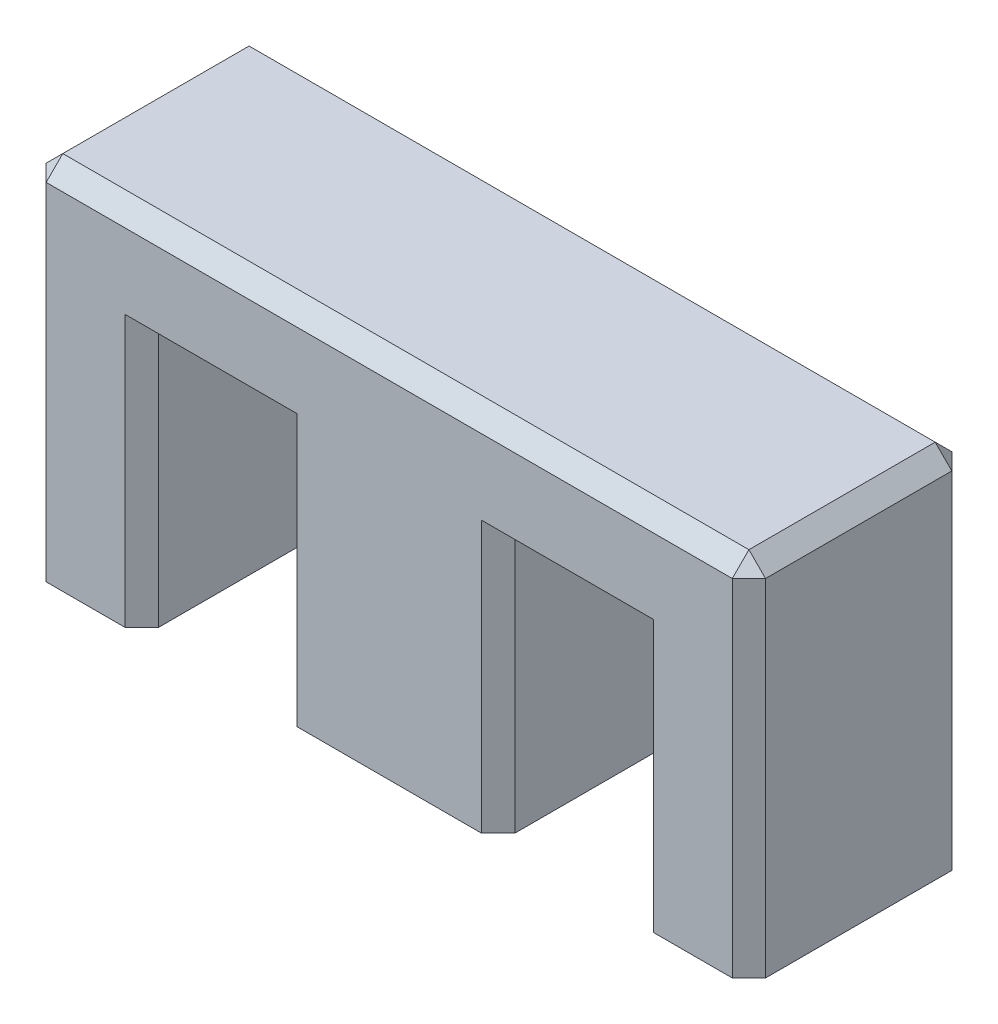
ISO-10303-21;
HEADER;
FILE_DESCRIPTION(('STEP AP214'),'2;1');
FILE_NAME('part.step','',(''),(''),'','','');
FILE_SCHEMA(('AUTOMOTIVE_DESIGN { 1 0 10303 214 1 1 1 1 }'));
ENDSEC;
DATA;
#1=APPLICATION_CONTEXT('core data for automotive mechanical design processes');
#2=APPLICATION_PROTOCOL_DEFINITION('international standard','automotive_design',2000,#1);
#3=PRODUCT_CONTEXT('',#1,'mechanical');
#4=PRODUCT('Part','Part','',(#3));
#5=PRODUCT_RELATED_PRODUCT_CATEGORY('part','',(#4));
#6=PRODUCT_DEFINITION_FORMATION('','',#4);
#7=PRODUCT_DEFINITION_CONTEXT('part definition',#1,'design');
#8=PRODUCT_DEFINITION('design','',#6,#7);
#9=PRODUCT_DEFINITION_SHAPE('','',#8);
#10=(LENGTH_UNIT() NAMED_UNIT(*) SI_UNIT(.MILLI.,.METRE.));
#11=(NAMED_UNIT(*) PLANE_ANGLE_UNIT() SI_UNIT($,.RADIAN.));
#12=(NAMED_UNIT(*) SI_UNIT($,.STERADIAN.) SOLID_ANGLE_UNIT());
#13=UNCERTAINTY_MEASURE_WITH_UNIT(LENGTH_MEASURE(1.E-05),#10,'distance_accuracy_value','');
#14=(GEOMETRIC_REPRESENTATION_CONTEXT(3) GLOBAL_UNCERTAINTY_ASSIGNED_CONTEXT((#13)) GLOBAL_UNIT_ASSIGNED_CONTEXT((#10,
#11,#12)) REPRESENTATION_CONTEXT('',''));
#15=CARTESIAN_POINT('',(0.,0.,0.));
#16=DIRECTION('',(0.,0.,1.));
#17=DIRECTION('',(1.,0.,0.));
#18=AXIS2_PLACEMENT_3D('',#15,#16,#17);
#19=CARTESIAN_POINT('',(29.75,18.1735294117647,13.2));
#20=DIRECTION('',(0.,1.,0.));
#21=DIRECTION('',(-1.,0.,0.));
#22=AXIS2_PLACEMENT_3D('',#19,#20,#21);
#23=PLANE('',#22);
#24=DIRECTION('',(0.,0.,-1.));
#25=VECTOR('',#24,1.);
#26=CARTESIAN_POINT('',(13.1,18.1735294117647,13.2));
#27=LINE('',#26,#25);
#28=CARTESIAN_POINT('',(13.1,18.1735294117647,11.2));
#29=VERTEX_POINT('',#28);
#30=CARTESIAN_POINT('',(13.1,18.1735294117647,-11.2));
#31=VERTEX_POINT('',#30);
#32=EDGE_CURVE('E416',#29,#31,#27,.T.);
#33=ORIENTED_EDGE('',*,*,#32,.T.);
#34=DIRECTION('',(1.,0.,0.));
#35=VECTOR('',#34,1.);
#36=CARTESIAN_POINT('',(29.75,18.1735294117647,-11.2));
#37=LINE('',#36,#35);
#38=CARTESIAN_POINT('',(29.75,18.1735294117647,-11.2));
#39=VERTEX_POINT('',#38);
#40=EDGE_CURVE('E340',#31,#39,#37,.T.);
#41=ORIENTED_EDGE('',*,*,#40,.T.);
#42=DIRECTION('',(0.,0.,-1.));
#43=VECTOR('',#42,1.);
#44=CARTESIAN_POINT('',(29.75,18.1735294117647,13.2));
#45=LINE('',#44,#43);
#46=CARTESIAN_POINT('',(29.75,18.1735294117647,11.2));
#47=VERTEX_POINT('',#46);
#48=EDGE_CURVE('E246',#47,#39,#45,.T.);
#49=ORIENTED_EDGE('',*,*,#48,.F.);
#50=DIRECTION('',(-1.,0.,0.));
#51=VECTOR('',#50,1.);
#52=CARTESIAN_POINT('',(13.1,18.1735294117647,11.2));
#53=LINE('',#52,#51);
#54=EDGE_CURVE('E338',#47,#29,#53,.T.);
#55=ORIENTED_EDGE('',*,*,#54,.T.);
#56=EDGE_LOOP('',(#33,#41,#49,#55));
#57=FACE_BOUND('',#56,.T.);
#58=ADVANCED_FACE('F39',(#57),#23,.F.);
#59=CARTESIAN_POINT('',(29.75,-12.4264705882353,13.2));
#60=DIRECTION('',(1.,0.,0.));
#61=DIRECTION('',(0.,1.,0.));
#62=AXIS2_PLACEMENT_3D('',#59,#60,#61);
#63=PLANE('',#62);
#64=ORIENTED_EDGE('',*,*,#48,.T.);
#65=DIRECTION('',(0.,-1.,0.));
#66=VECTOR('',#65,1.);
#67=CARTESIAN_POINT('',(29.75,-12.4264705882353,-11.2));
#68=LINE('',#67,#66);
#69=CARTESIAN_POINT('',(29.75,-12.4264705882353,-11.2));
#70=VERTEX_POINT('',#69);
#71=EDGE_CURVE('E336',#39,#70,#68,.T.);
#72=ORIENTED_EDGE('',*,*,#71,.T.);
#73=DIRECTION('',(0.,0.,-1.));
#74=VECTOR('',#73,1.);
#75=CARTESIAN_POINT('',(29.75,-12.4264705882353,13.2));
#76=LINE('',#75,#74);
#77=CARTESIAN_POINT('',(29.75,-12.4264705882353,11.2));
#78=VERTEX_POINT('',#77);
#79=EDGE_CURVE('E451',#78,#70,#76,.T.);
#80=ORIENTED_EDGE('',*,*,#79,.F.);
#81=DIRECTION('',(0.,1.,0.));
#82=VECTOR('',#81,1.);
#83=CARTESIAN_POINT('',(29.75,18.1735294117647,11.2));
#84=LINE('',#83,#82);
#85=EDGE_CURVE('E334',#78,#47,#84,.T.);
#86=ORIENTED_EDGE('',*,*,#85,.T.);
#87=EDGE_LOOP('',(#64,#72,#80,#86));
#88=FACE_BOUND('',#87,.T.);
#89=ADVANCED_FACE('F526',(#88),#63,.F.);
#90=CARTESIAN_POINT('',(43.25,-12.4264705882353,13.2));
#91=DIRECTION('',(0.,1.,0.));
#92=DIRECTION('',(-1.,0.,0.));
#93=AXIS2_PLACEMENT_3D('',#90,#91,#92);
#94=PLANE('',#93);
#95=DIRECTION('',(0.,0.,-1.));
#96=VECTOR('',#95,1.);
#97=CARTESIAN_POINT('',(43.25,-12.4264705882353,13.2));
#98=LINE('',#97,#96);
#99=CARTESIAN_POINT('',(43.25,-12.4264705882353,11.2));
#100=VERTEX_POINT('',#99);
#101=CARTESIAN_POINT('',(43.25,-12.4264705882353,-11.2));
#102=VERTEX_POINT('',#101);
#103=EDGE_CURVE('E448',#100,#102,#98,.T.);
#104=ORIENTED_EDGE('',*,*,#103,.F.);
#105=DIRECTION('',(-0.707106781186551,0.,0.707106781186545));
#106=VECTOR('',#105,1.);
#107=CARTESIAN_POINT('',(41.25,-12.4264705882353,13.2));
#108=LINE('',#107,#106);
#109=CARTESIAN_POINT('',(41.25,-12.4264705882353,13.2));
#110=VERTEX_POINT('',#109);
#111=EDGE_CURVE('E287',#100,#110,#108,.T.);
#112=ORIENTED_EDGE('',*,*,#111,.T.);
#113=DIRECTION('',(1.,0.,0.));
#114=VECTOR('',#113,1.);
#115=CARTESIAN_POINT('',(43.25,-12.4264705882353,13.2));
#116=LINE('',#115,#114);
#117=CARTESIAN_POINT('',(31.75,-12.4264705882353,13.2));
#118=VERTEX_POINT('',#117);
#119=EDGE_CURVE('E423',#118,#110,#116,.T.);
#120=ORIENTED_EDGE('',*,*,#119,.F.);
#121=DIRECTION('',(-0.707106781186547,0.,-0.707106781186548));
#122=VECTOR('',#121,1.);
#123=CARTESIAN_POINT('',(31.75,-12.4264705882353,13.2));
#124=LINE('',#123,#122);
#125=EDGE_CURVE('E281',#118,#78,#124,.T.);
#126=ORIENTED_EDGE('',*,*,#125,.T.);
#127=ORIENTED_EDGE('',*,*,#79,.T.);
#128=DIRECTION('',(-0.707106781186549,0.,0.707106781186546));
#129=VECTOR('',#128,1.);
#130=CARTESIAN_POINT('',(29.75,-12.4264705882353,-11.2));
#131=LINE('',#130,#129);
#132=CARTESIAN_POINT('',(31.75,-12.4264705882353,-13.2));
#133=VERTEX_POINT('',#132);
#134=EDGE_CURVE('E283',#70,#133,#131,.F.);
#135=ORIENTED_EDGE('',*,*,#134,.T.);
#136=DIRECTION('',(1.,0.,0.));
#137=VECTOR('',#136,1.);
#138=CARTESIAN_POINT('',(43.25,-12.4264705882353,-13.2));
#139=LINE('',#138,#137);
#140=CARTESIAN_POINT('',(41.25,-12.4264705882353,-13.2));
#141=VERTEX_POINT('',#140);
#142=EDGE_CURVE('E374',#133,#141,#139,.T.);
#143=ORIENTED_EDGE('',*,*,#142,.T.);
#144=DIRECTION('',(-0.707106781186551,0.,-0.707106781186545));
#145=VECTOR('',#144,1.);
#146=CARTESIAN_POINT('',(43.25,-12.4264705882353,-11.2));
#147=LINE('',#146,#145);
#148=EDGE_CURVE('E285',#141,#102,#147,.F.);
#149=ORIENTED_EDGE('',*,*,#148,.T.);
#150=EDGE_LOOP('',(#104,#112,#120,#126,#127,#135,#143,#149));
#151=FACE_BOUND('',#150,.T.);
#152=ADVANCED_FACE('F490',(#151),#94,.F.);
#153=CARTESIAN_POINT('',(43.25,31.1735294117647,13.2));
#154=DIRECTION('',(-1.,0.,0.));
#155=DIRECTION('',(0.,-1.,0.));
#156=AXIS2_PLACEMENT_3D('',#153,#154,#155);
#157=PLANE('',#156);
#158=DIRECTION('',(0.,0.,1.));
#159=VECTOR('',#158,1.);
#160=CARTESIAN_POINT('',(43.25,29.1735294117647,13.2));
#161=LINE('',#160,#159);
#162=CARTESIAN_POINT('',(43.25,29.1735294117647,-11.2));
#163=VERTEX_POINT('',#162);
#164=CARTESIAN_POINT('',(43.25,29.1735294117647,11.2));
#165=VERTEX_POINT('',#164);
#166=EDGE_CURVE('E222',#163,#165,#161,.T.);
#167=ORIENTED_EDGE('',*,*,#166,.T.);
#168=DIRECTION('',(0.,-1.,0.));
#169=VECTOR('',#168,1.);
#170=CARTESIAN_POINT('',(43.25,-12.4264705882353,11.2));
#171=LINE('',#170,#169);
#172=EDGE_CURVE('E259',#165,#100,#171,.T.);
#173=ORIENTED_EDGE('',*,*,#172,.T.);
#174=ORIENTED_EDGE('',*,*,#103,.T.);
#175=DIRECTION('',(0.,1.,0.));
#176=VECTOR('',#175,1.);
#177=CARTESIAN_POINT('',(43.25,31.1735294117647,-11.2));
#178=LINE('',#177,#176);
#179=EDGE_CURVE('E252',#102,#163,#178,.T.);
#180=ORIENTED_EDGE('',*,*,#179,.T.);
#181=EDGE_LOOP('',(#167,#173,#174,#180));
#182=FACE_BOUND('',#181,.T.);
#183=ADVANCED_FACE('F478',(#182),#157,.F.);
#184=CARTESIAN_POINT('',(43.25,31.1735294117647,13.2));
#185=DIRECTION('',(0.,-1.,0.));
#186=DIRECTION('',(1.,0.,0.));
#187=AXIS2_PLACEMENT_3D('',#184,#185,#186);
#188=PLANE('',#187);
#189=DIRECTION('',(1.,0.,0.));
#190=VECTOR('',#189,1.);
#191=CARTESIAN_POINT('',(43.25,31.1735294117647,11.2));
#192=LINE('',#191,#190);
#193=CARTESIAN_POINT('',(-41.25,31.1735294117647,11.2));
#194=VERTEX_POINT('',#193);
#195=CARTESIAN_POINT('',(41.25,31.1735294117647,11.2));
#196=VERTEX_POINT('',#195);
#197=EDGE_CURVE('E250',#194,#196,#192,.T.);
#198=ORIENTED_EDGE('',*,*,#197,.T.);
#199=DIRECTION('',(0.,0.,-1.));
#200=VECTOR('',#199,1.);
#201=CARTESIAN_POINT('',(41.25,31.1735294117647,13.2));
#202=LINE('',#201,#200);
#203=CARTESIAN_POINT('',(41.25,31.1735294117647,-11.2));
#204=VERTEX_POINT('',#203);
#205=EDGE_CURVE('E220',#196,#204,#202,.T.);
#206=ORIENTED_EDGE('',*,*,#205,.T.);
#207=DIRECTION('',(-1.,0.,0.));
#208=VECTOR('',#207,1.);
#209=CARTESIAN_POINT('',(43.25,31.1735294117647,-11.2));
#210=LINE('',#209,#208);
#211=CARTESIAN_POINT('',(-41.25,31.1735294117647,-11.2));
#212=VERTEX_POINT('',#211);
#213=EDGE_CURVE('E239',#204,#212,#210,.T.);
#214=ORIENTED_EDGE('',*,*,#213,.T.);
#215=DIRECTION('',(0.,0.,1.));
#216=VECTOR('',#215,1.);
#217=CARTESIAN_POINT('',(-41.25,31.1735294117647,13.2));
#218=LINE('',#217,#216);
#219=EDGE_CURVE('E245',#212,#194,#218,.T.);
#220=ORIENTED_EDGE('',*,*,#219,.T.);
#221=EDGE_LOOP('',(#198,#206,#214,#220));
#222=FACE_BOUND('',#221,.T.);
#223=ADVANCED_FACE('F248',(#222),#188,.F.);
#224=CARTESIAN_POINT('',(-43.25,31.1735294117647,13.2));
#225=DIRECTION('',(1.,0.,0.));
#226=DIRECTION('',(0.,0.,-1.));
#227=AXIS2_PLACEMENT_3D('',#224,#225,#226);
#228=PLANE('',#227);
#229=DIRECTION('',(0.,0.,-1.));
#230=VECTOR('',#229,1.);
#231=CARTESIAN_POINT('',(-43.25,-12.4264705882353,13.2));
#232=LINE('',#231,#230);
#233=CARTESIAN_POINT('',(-43.25,-12.4264705882353,11.2));
#234=VERTEX_POINT('',#233);
#235=CARTESIAN_POINT('',(-43.25,-12.4264705882353,-11.2));
#236=VERTEX_POINT('',#235);
#237=EDGE_CURVE('E445',#234,#236,#232,.T.);
#238=ORIENTED_EDGE('',*,*,#237,.F.);
#239=DIRECTION('',(0.,1.,0.));
#240=VECTOR('',#239,1.);
#241=CARTESIAN_POINT('',(-43.25,31.1735294117647,11.2));
#242=LINE('',#241,#240);
#243=CARTESIAN_POINT('',(-43.25,29.1735294117647,11.2));
#244=VERTEX_POINT('',#243);
#245=EDGE_CURVE('E301',#234,#244,#242,.T.);
#246=ORIENTED_EDGE('',*,*,#245,.T.);
#247=DIRECTION('',(0.,0.,-1.));
#248=VECTOR('',#247,1.);
#249=CARTESIAN_POINT('',(-43.25,29.1735294117647,13.2));
#250=LINE('',#249,#248);
#251=CARTESIAN_POINT('',(-43.25,29.1735294117647,-11.2));
#252=VERTEX_POINT('',#251);
#253=EDGE_CURVE('E299',#244,#252,#250,.T.);
#254=ORIENTED_EDGE('',*,*,#253,.T.);
#255=DIRECTION('',(0.,-1.,0.));
#256=VECTOR('',#255,1.);
#257=CARTESIAN_POINT('',(-43.25,31.1735294117647,-11.2));
#258=LINE('',#257,#256);
#259=EDGE_CURVE('E297',#252,#236,#258,.T.);
#260=ORIENTED_EDGE('',*,*,#259,.T.);
#261=EDGE_LOOP('',(#238,#246,#254,#260));
#262=FACE_BOUND('',#261,.T.);
#263=ADVANCED_FACE('F807',(#262),#228,.F.);
#264=CARTESIAN_POINT('',(-43.25,-12.4264705882353,13.2));
#265=DIRECTION('',(0.,1.,0.));
#266=DIRECTION('',(0.,0.,1.));
#267=AXIS2_PLACEMENT_3D('',#264,#265,#266);
#268=PLANE('',#267);
#269=DIRECTION('',(1.,0.,0.));
#270=VECTOR('',#269,1.);
#271=CARTESIAN_POINT('',(-43.25,-12.4264705882353,13.2));
#272=LINE('',#271,#270);
#273=CARTESIAN_POINT('',(-41.25,-12.4264705882353,13.2));
#274=VERTEX_POINT('',#273);
#275=CARTESIAN_POINT('',(-31.75,-12.4264705882353,13.2));
#276=VERTEX_POINT('',#275);
#277=EDGE_CURVE('E417',#274,#276,#272,.T.);
#278=ORIENTED_EDGE('',*,*,#277,.F.);
#279=DIRECTION('',(-0.707106781186545,0.,-0.70710678118655));
#280=VECTOR('',#279,1.);
#281=CARTESIAN_POINT('',(-41.25,-12.4264705882353,13.2));
#282=LINE('',#281,#280);
#283=EDGE_CURVE('E295',#274,#234,#282,.T.);
#284=ORIENTED_EDGE('',*,*,#283,.T.);
#285=ORIENTED_EDGE('',*,*,#237,.T.);
#286=DIRECTION('',(-0.70710678118655,0.,0.707106781186545));
#287=VECTOR('',#286,1.);
#288=CARTESIAN_POINT('',(-43.25,-12.4264705882353,-11.2));
#289=LINE('',#288,#287);
#290=CARTESIAN_POINT('',(-41.25,-12.4264705882353,-13.2));
#291=VERTEX_POINT('',#290);
#292=EDGE_CURVE('E293',#236,#291,#289,.F.);
#293=ORIENTED_EDGE('',*,*,#292,.T.);
#294=DIRECTION('',(1.,0.,0.));
#295=VECTOR('',#294,1.);
#296=CARTESIAN_POINT('',(-43.25,-12.4264705882353,-13.2));
#297=LINE('',#296,#295);
#298=CARTESIAN_POINT('',(-31.75,-12.4264705882353,-13.2));
#299=VERTEX_POINT('',#298);
#300=EDGE_CURVE('E429',#291,#299,#297,.T.);
#301=ORIENTED_EDGE('',*,*,#300,.T.);
#302=DIRECTION('',(-0.70710678118655,0.,-0.707106781186545));
#303=VECTOR('',#302,1.);
#304=CARTESIAN_POINT('',(-29.75,-12.4264705882353,-11.2));
#305=LINE('',#304,#303);
#306=CARTESIAN_POINT('',(-29.75,-12.4264705882353,-11.2));
#307=VERTEX_POINT('',#306);
#308=EDGE_CURVE('E291',#299,#307,#305,.F.);
#309=ORIENTED_EDGE('',*,*,#308,.T.);
#310=DIRECTION('',(0.,0.,-1.));
#311=VECTOR('',#310,1.);
#312=CARTESIAN_POINT('',(-29.75,-12.4264705882353,13.2));
#313=LINE('',#312,#311);
#314=CARTESIAN_POINT('',(-29.75,-12.4264705882353,11.2));
#315=VERTEX_POINT('',#314);
#316=EDGE_CURVE('E442',#315,#307,#313,.T.);
#317=ORIENTED_EDGE('',*,*,#316,.F.);
#318=DIRECTION('',(-0.707106781186545,0.,0.70710678118655));
#319=VECTOR('',#318,1.);
#320=CARTESIAN_POINT('',(-31.75,-12.4264705882353,13.2));
#321=LINE('',#320,#319);
#322=EDGE_CURVE('E289',#315,#276,#321,.T.);
#323=ORIENTED_EDGE('',*,*,#322,.T.);
#324=EDGE_LOOP('',(#278,#284,#285,#293,#301,#309,#317,#323));
#325=FACE_BOUND('',#324,.T.);
#326=ADVANCED_FACE('F799',(#325),#268,.F.);
#327=CARTESIAN_POINT('',(-29.75,-12.4264705882353,13.2));
#328=DIRECTION('',(-1.,0.,0.));
#329=DIRECTION('',(0.,0.,1.));
#330=AXIS2_PLACEMENT_3D('',#327,#328,#329);
#331=PLANE('',#330);
#332=ORIENTED_EDGE('',*,*,#316,.T.);
#333=DIRECTION('',(0.,1.,0.));
#334=VECTOR('',#333,1.);
#335=CARTESIAN_POINT('',(-29.75,-12.4264705882353,-11.2));
#336=LINE('',#335,#334);
#337=CARTESIAN_POINT('',(-29.75,18.1735294117647,-11.2));
#338=VERTEX_POINT('',#337);
#339=EDGE_CURVE('E344',#307,#338,#336,.T.);
#340=ORIENTED_EDGE('',*,*,#339,.T.);
#341=DIRECTION('',(0.,0.,-1.));
#342=VECTOR('',#341,1.);
#343=CARTESIAN_POINT('',(-29.75,18.1735294117647,13.2));
#344=LINE('',#343,#342);
#345=CARTESIAN_POINT('',(-29.75,18.1735294117647,11.2));
#346=VERTEX_POINT('',#345);
#347=EDGE_CURVE('E440',#346,#338,#344,.T.);
#348=ORIENTED_EDGE('',*,*,#347,.F.);
#349=DIRECTION('',(0.,-1.,0.));
#350=VECTOR('',#349,1.);
#351=CARTESIAN_POINT('',(-29.75,-12.4264705882353,11.2));
#352=LINE('',#351,#350);
#353=EDGE_CURVE('E342',#346,#315,#352,.T.);
#354=ORIENTED_EDGE('',*,*,#353,.T.);
#355=EDGE_LOOP('',(#332,#340,#348,#354));
#356=FACE_BOUND('',#355,.T.);
#357=ADVANCED_FACE('F792',(#356),#331,.F.);
#358=CARTESIAN_POINT('',(-29.75,18.1735294117647,13.2));
#359=DIRECTION('',(0.,1.,0.));
#360=DIRECTION('',(-1.,0.,0.));
#361=AXIS2_PLACEMENT_3D('',#358,#359,#360);
#362=PLANE('',#361);
#363=ORIENTED_EDGE('',*,*,#347,.T.);
#364=DIRECTION('',(1.,0.,0.));
#365=VECTOR('',#364,1.);
#366=CARTESIAN_POINT('',(-29.75,18.1735294117647,-11.2));
#367=LINE('',#366,#365);
#368=CARTESIAN_POINT('',(-13.1,18.1735294117647,-11.2));
#369=VERTEX_POINT('',#368);
#370=EDGE_CURVE('E11',#338,#369,#367,.T.);
#371=ORIENTED_EDGE('',*,*,#370,.T.);
#372=DIRECTION('',(0.,0.,-1.));
#373=VECTOR('',#372,1.);
#374=CARTESIAN_POINT('',(-13.1,18.1735294117647,13.2));
#375=LINE('',#374,#373);
#376=CARTESIAN_POINT('',(-13.1,18.1735294117647,11.2));
#377=VERTEX_POINT('',#376);
#378=EDGE_CURVE('E438',#377,#369,#375,.T.);
#379=ORIENTED_EDGE('',*,*,#378,.F.);
#380=DIRECTION('',(-1.,0.,0.));
#381=VECTOR('',#380,1.);
#382=CARTESIAN_POINT('',(-29.75,18.1735294117647,11.2));
#383=LINE('',#382,#381);
#384=EDGE_CURVE('E49',#377,#346,#383,.T.);
#385=ORIENTED_EDGE('',*,*,#384,.T.);
#386=EDGE_LOOP('',(#363,#371,#379,#385));
#387=FACE_BOUND('',#386,.T.);
#388=ADVANCED_FACE('F785',(#387),#362,.F.);
#389=CARTESIAN_POINT('',(-13.1,18.1735294117647,13.2));
#390=DIRECTION('',(1.,0.,0.));
#391=DIRECTION('',(0.,1.,0.));
#392=AXIS2_PLACEMENT_3D('',#389,#390,#391);
#393=PLANE('',#392);
#394=ORIENTED_EDGE('',*,*,#378,.T.);
#395=DIRECTION('',(0.,-1.,0.));
#396=VECTOR('',#395,1.);
#397=CARTESIAN_POINT('',(-13.1,18.1735294117647,-11.2));
#398=LINE('',#397,#396);
#399=CARTESIAN_POINT('',(-13.1,-12.4264705882353,-11.2));
#400=VERTEX_POINT('',#399);
#401=EDGE_CURVE('E348',#369,#400,#398,.T.);
#402=ORIENTED_EDGE('',*,*,#401,.T.);
#403=DIRECTION('',(0.,0.,-1.));
#404=VECTOR('',#403,1.);
#405=CARTESIAN_POINT('',(-13.1,-12.4264705882353,13.2));
#406=LINE('',#405,#404);
#407=CARTESIAN_POINT('',(-13.1,-12.4264705882353,11.2));
#408=VERTEX_POINT('',#407);
#409=EDGE_CURVE('E436',#408,#400,#406,.T.);
#410=ORIENTED_EDGE('',*,*,#409,.F.);
#411=DIRECTION('',(0.,1.,0.));
#412=VECTOR('',#411,1.);
#413=CARTESIAN_POINT('',(-13.1,18.1735294117647,11.2));
#414=LINE('',#413,#412);
#415=EDGE_CURVE('E62',#408,#377,#414,.T.);
#416=ORIENTED_EDGE('',*,*,#415,.T.);
#417=EDGE_LOOP('',(#394,#402,#410,#416));
#418=FACE_BOUND('',#417,.T.);
#419=ADVANCED_FACE('F778',(#418),#393,.F.);
#420=CARTESIAN_POINT('',(-13.1,-12.4264705882353,13.2));
#421=DIRECTION('',(0.,1.,0.));
#422=DIRECTION('',(-1.,0.,0.));
#423=AXIS2_PLACEMENT_3D('',#420,#421,#422);
#424=PLANE('',#423);
#425=DIRECTION('',(1.,0.,0.));
#426=VECTOR('',#425,1.);
#427=CARTESIAN_POINT('',(-13.1,-12.4264705882353,-13.2));
#428=LINE('',#427,#426);
#429=CARTESIAN_POINT('',(-11.1,-12.4264705882353,-13.2));
#430=VERTEX_POINT('',#429);
#431=CARTESIAN_POINT('',(11.1,-12.4264705882353,-13.2));
#432=VERTEX_POINT('',#431);
#433=EDGE_CURVE('E432',#430,#432,#428,.T.);
#434=ORIENTED_EDGE('',*,*,#433,.T.);
#435=DIRECTION('',(-0.70710678118655,0.,-0.707106781186545));
#436=VECTOR('',#435,1.);
#437=CARTESIAN_POINT('',(13.1,-12.4264705882353,-11.2));
#438=LINE('',#437,#436);
#439=CARTESIAN_POINT('',(13.1,-12.4264705882353,-11.2));
#440=VERTEX_POINT('',#439);
#441=EDGE_CURVE('E332',#432,#440,#438,.F.);
#442=ORIENTED_EDGE('',*,*,#441,.T.);
#443=DIRECTION('',(0.,0.,-1.));
#444=VECTOR('',#443,1.);
#445=CARTESIAN_POINT('',(13.1,-12.4264705882353,13.2));
#446=LINE('',#445,#444);
#447=CARTESIAN_POINT('',(13.1,-12.4264705882353,11.2));
#448=VERTEX_POINT('',#447);
#449=EDGE_CURVE('E420',#448,#440,#446,.T.);
#450=ORIENTED_EDGE('',*,*,#449,.F.);
#451=DIRECTION('',(-0.707106781186548,0.,0.707106781186547));
#452=VECTOR('',#451,1.);
#453=CARTESIAN_POINT('',(11.1,-12.4264705882353,13.2));
#454=LINE('',#453,#452);
#455=CARTESIAN_POINT('',(11.1,-12.4264705882353,13.2));
#456=VERTEX_POINT('',#455);
#457=EDGE_CURVE('E328',#448,#456,#454,.T.);
#458=ORIENTED_EDGE('',*,*,#457,.T.);
#459=DIRECTION('',(1.,0.,0.));
#460=VECTOR('',#459,1.);
#461=CARTESIAN_POINT('',(-13.1,-12.4264705882353,13.2));
#462=LINE('',#461,#460);
#463=CARTESIAN_POINT('',(-11.1,-12.4264705882353,13.2));
#464=VERTEX_POINT('',#463);
#465=EDGE_CURVE('E408',#464,#456,#462,.T.);
#466=ORIENTED_EDGE('',*,*,#465,.F.);
#467=DIRECTION('',(-0.707106781186545,0.,-0.70710678118655));
#468=VECTOR('',#467,1.);
#469=CARTESIAN_POINT('',(-11.1,-12.4264705882353,13.2));
#470=LINE('',#469,#468);
#471=EDGE_CURVE('E326',#464,#408,#470,.T.);
#472=ORIENTED_EDGE('',*,*,#471,.T.);
#473=ORIENTED_EDGE('',*,*,#409,.T.);
#474=DIRECTION('',(-0.70710678118655,0.,0.707106781186545));
#475=VECTOR('',#474,1.);
#476=CARTESIAN_POINT('',(-13.1,-12.4264705882353,-11.2));
#477=LINE('',#476,#475);
#478=EDGE_CURVE('E330',#400,#430,#477,.F.);
#479=ORIENTED_EDGE('',*,*,#478,.T.);
#480=EDGE_LOOP('',(#434,#442,#450,#458,#466,#472,#473,#479));
#481=FACE_BOUND('',#480,.T.);
#482=ADVANCED_FACE('F412',(#481),#424,.F.);
#483=CARTESIAN_POINT('',(13.1,18.1735294117647,13.2));
#484=DIRECTION('',(-1.,0.,0.));
#485=DIRECTION('',(0.,-1.,0.));
#486=AXIS2_PLACEMENT_3D('',#483,#484,#485);
#487=PLANE('',#486);
#488=ORIENTED_EDGE('',*,*,#449,.T.);
#489=DIRECTION('',(0.,1.,0.));
#490=VECTOR('',#489,1.);
#491=CARTESIAN_POINT('',(13.1,18.1735294117647,-11.2));
#492=LINE('',#491,#490);
#493=EDGE_CURVE('E323',#440,#31,#492,.T.);
#494=ORIENTED_EDGE('',*,*,#493,.T.);
#495=ORIENTED_EDGE('',*,*,#32,.F.);
#496=DIRECTION('',(0.,-1.,0.));
#497=VECTOR('',#496,1.);
#498=CARTESIAN_POINT('',(13.1,-12.4264705882353,11.2));
#499=LINE('',#498,#497);
#500=EDGE_CURVE('E321',#29,#448,#499,.T.);
#501=ORIENTED_EDGE('',*,*,#500,.T.);
#502=EDGE_LOOP('',(#488,#494,#495,#501));
#503=FACE_BOUND('',#502,.T.);
#504=ADVANCED_FACE('F512',(#503),#487,.F.);
#505=CARTESIAN_POINT('',(0.,0.,13.2));
#506=DIRECTION('',(0.,0.,1.));
#507=DIRECTION('',(1.,0.,0.));
#508=AXIS2_PLACEMENT_3D('',#505,#506,#507);
#509=PLANE('',#508);
#510=ORIENTED_EDGE('',*,*,#119,.T.);
#511=DIRECTION('',(0.,1.,0.));
#512=VECTOR('',#511,1.);
#513=CARTESIAN_POINT('',(41.25,31.1735294117647,13.2));
#514=LINE('',#513,#512);
#515=CARTESIAN_POINT('',(41.25,29.1735294117647,13.2));
#516=VERTEX_POINT('',#515);
#517=EDGE_CURVE('E279',#110,#516,#514,.T.);
#518=ORIENTED_EDGE('',*,*,#517,.T.);
#519=DIRECTION('',(-1.,0.,0.));
#520=VECTOR('',#519,1.);
#521=CARTESIAN_POINT('',(-43.25,29.1735294117647,13.2));
#522=LINE('',#521,#520);
#523=CARTESIAN_POINT('',(-41.25,29.1735294117647,13.2));
#524=VERTEX_POINT('',#523);
#525=EDGE_CURVE('E277',#516,#524,#522,.T.);
#526=ORIENTED_EDGE('',*,*,#525,.T.);
#527=DIRECTION('',(0.,-1.,0.));
#528=VECTOR('',#527,1.);
#529=CARTESIAN_POINT('',(-41.25,-12.4264705882353,13.2));
#530=LINE('',#529,#528);
#531=EDGE_CURVE('E275',#524,#274,#530,.T.);
#532=ORIENTED_EDGE('',*,*,#531,.T.);
#533=ORIENTED_EDGE('',*,*,#277,.T.);
#534=DIRECTION('',(0.,1.,0.));
#535=VECTOR('',#534,1.);
#536=CARTESIAN_POINT('',(-31.75,18.1735294117647,13.2));
#537=LINE('',#536,#535);
#538=CARTESIAN_POINT('',(-31.75,20.1735294117647,13.2));
#539=VERTEX_POINT('',#538);
#540=EDGE_CURVE('E265',#276,#539,#537,.T.);
#541=ORIENTED_EDGE('',*,*,#540,.T.);
#542=DIRECTION('',(1.,0.,0.));
#543=VECTOR('',#542,1.);
#544=CARTESIAN_POINT('',(-13.1,20.1735294117647,13.2));
#545=LINE('',#544,#543);
#546=CARTESIAN_POINT('',(-11.1,20.1735294117647,13.2));
#547=VERTEX_POINT('',#546);
#548=EDGE_CURVE('E261',#539,#547,#545,.T.);
#549=ORIENTED_EDGE('',*,*,#548,.T.);
#550=DIRECTION('',(0.,-1.,0.));
#551=VECTOR('',#550,1.);
#552=CARTESIAN_POINT('',(-11.1,-12.4264705882353,13.2));
#553=LINE('',#552,#551);
#554=EDGE_CURVE('E263',#547,#464,#553,.T.);
#555=ORIENTED_EDGE('',*,*,#554,.T.);
#556=ORIENTED_EDGE('',*,*,#465,.T.);
#557=DIRECTION('',(0.,1.,0.));
#558=VECTOR('',#557,1.);
#559=CARTESIAN_POINT('',(11.1,18.1735294117647,13.2));
#560=LINE('',#559,#558);
#561=CARTESIAN_POINT('',(11.1,20.1735294117647,13.2));
#562=VERTEX_POINT('',#561);
#563=EDGE_CURVE('E270',#456,#562,#560,.T.);
#564=ORIENTED_EDGE('',*,*,#563,.T.);
#565=DIRECTION('',(1.,0.,0.));
#566=VECTOR('',#565,1.);
#567=CARTESIAN_POINT('',(29.75,20.1735294117647,13.2));
#568=LINE('',#567,#566);
#569=CARTESIAN_POINT('',(31.75,20.1735294117647,13.2));
#570=VERTEX_POINT('',#569);
#571=EDGE_CURVE('E268',#562,#570,#568,.T.);
#572=ORIENTED_EDGE('',*,*,#571,.T.);
#573=DIRECTION('',(0.,-1.,0.));
#574=VECTOR('',#573,1.);
#575=CARTESIAN_POINT('',(31.75,-12.4264705882353,13.2));
#576=LINE('',#575,#574);
#577=EDGE_CURVE('E272',#570,#118,#576,.T.);
#578=ORIENTED_EDGE('',*,*,#577,.T.);
#579=EDGE_LOOP('',(#510,#518,#526,#532,#533,#541,#549,#555,#556,#564,#572,#578));
#580=FACE_BOUND('',#579,.T.);
#581=ADVANCED_FACE('F407',(#580),#509,.T.);
#582=CARTESIAN_POINT('',(0.,0.,-13.2));
#583=DIRECTION('',(0.,0.,1.));
#584=DIRECTION('',(1.,0.,0.));
#585=AXIS2_PLACEMENT_3D('',#582,#583,#584);
#586=PLANE('',#585);
#587=ORIENTED_EDGE('',*,*,#300,.F.);
#588=DIRECTION('',(0.,1.,0.));
#589=VECTOR('',#588,1.);
#590=CARTESIAN_POINT('',(-41.25,0.,-13.2));
#591=LINE('',#590,#589);
#592=CARTESIAN_POINT('',(-41.25,29.1735294117647,-13.2));
#593=VERTEX_POINT('',#592);
#594=EDGE_CURVE('E319',#291,#593,#591,.T.);
#595=ORIENTED_EDGE('',*,*,#594,.T.);
#596=DIRECTION('',(1.,0.,0.));
#597=VECTOR('',#596,1.);
#598=CARTESIAN_POINT('',(0.,29.1735294117647,-13.2));
#599=LINE('',#598,#597);
#600=CARTESIAN_POINT('',(41.25,29.1735294117647,-13.2));
#601=VERTEX_POINT('',#600);
#602=EDGE_CURVE('E317',#593,#601,#599,.T.);
#603=ORIENTED_EDGE('',*,*,#602,.T.);
#604=DIRECTION('',(0.,-1.,0.));
#605=VECTOR('',#604,1.);
#606=CARTESIAN_POINT('',(41.25,0.,-13.2));
#607=LINE('',#606,#605);
#608=EDGE_CURVE('E315',#601,#141,#607,.T.);
#609=ORIENTED_EDGE('',*,*,#608,.T.);
#610=ORIENTED_EDGE('',*,*,#142,.F.);
#611=DIRECTION('',(0.,1.,0.));
#612=VECTOR('',#611,1.);
#613=CARTESIAN_POINT('',(31.75,0.,-13.2));
#614=LINE('',#613,#612);
#615=CARTESIAN_POINT('',(31.75,20.1735294117647,-13.2));
#616=VERTEX_POINT('',#615);
#617=EDGE_CURVE('E311',#133,#616,#614,.T.);
#618=ORIENTED_EDGE('',*,*,#617,.T.);
#619=DIRECTION('',(-1.,0.,0.));
#620=VECTOR('',#619,1.);
#621=CARTESIAN_POINT('',(0.,20.1735294117647,-13.2));
#622=LINE('',#621,#620);
#623=CARTESIAN_POINT('',(11.1,20.1735294117647,-13.2));
#624=VERTEX_POINT('',#623);
#625=EDGE_CURVE('E309',#616,#624,#622,.T.);
#626=ORIENTED_EDGE('',*,*,#625,.T.);
#627=DIRECTION('',(0.,-1.,0.));
#628=VECTOR('',#627,1.);
#629=CARTESIAN_POINT('',(11.1,0.,-13.2));
#630=LINE('',#629,#628);
#631=EDGE_CURVE('E313',#624,#432,#630,.T.);
#632=ORIENTED_EDGE('',*,*,#631,.T.);
#633=ORIENTED_EDGE('',*,*,#433,.F.);
#634=DIRECTION('',(0.,1.,0.));
#635=VECTOR('',#634,1.);
#636=CARTESIAN_POINT('',(-11.1,0.,-13.2));
#637=LINE('',#636,#635);
#638=CARTESIAN_POINT('',(-11.1,20.1735294117647,-13.2));
#639=VERTEX_POINT('',#638);
#640=EDGE_CURVE('E305',#430,#639,#637,.T.);
#641=ORIENTED_EDGE('',*,*,#640,.T.);
#642=DIRECTION('',(-1.,0.,0.));
#643=VECTOR('',#642,1.);
#644=CARTESIAN_POINT('',(0.,20.1735294117647,-13.2));
#645=LINE('',#644,#643);
#646=CARTESIAN_POINT('',(-31.75,20.1735294117647,-13.2));
#647=VERTEX_POINT('',#646);
#648=EDGE_CURVE('E303',#639,#647,#645,.T.);
#649=ORIENTED_EDGE('',*,*,#648,.T.);
#650=DIRECTION('',(0.,-1.,0.));
#651=VECTOR('',#650,1.);
#652=CARTESIAN_POINT('',(-31.75,0.,-13.2));
#653=LINE('',#652,#651);
#654=EDGE_CURVE('E307',#647,#299,#653,.T.);
#655=ORIENTED_EDGE('',*,*,#654,.T.);
#656=EDGE_LOOP('',(#587,#595,#603,#609,#610,#618,#626,#632,#633,#641,#649,#655));
#657=FACE_BOUND('',#656,.T.);
#658=ADVANCED_FACE('F487',(#657),#586,.F.);
#659=CARTESIAN_POINT('',(-41.25,0.,13.2));
#660=DIRECTION('',(-0.70710678118655,0.,0.707106781186545));
#661=DIRECTION('',(0.,1.,0.));
#662=AXIS2_PLACEMENT_3D('',#659,#660,#661);
#663=PLANE('',#662);
#664=ORIENTED_EDGE('',*,*,#283,.F.);
#665=ORIENTED_EDGE('',*,*,#531,.F.);
#666=DIRECTION('',(0.707106781186545,0.,0.70710678118655));
#667=VECTOR('',#666,1.);
#668=CARTESIAN_POINT('',(-41.25,29.1735294117647,13.2));
#669=LINE('',#668,#667);
#670=EDGE_CURVE('E371',#244,#524,#669,.T.);
#671=ORIENTED_EDGE('',*,*,#670,.F.);
#672=ORIENTED_EDGE('',*,*,#245,.F.);
#673=EDGE_LOOP('',(#664,#665,#671,#672));
#674=FACE_BOUND('',#673,.T.);
#675=ADVANCED_FACE('F598',(#674),#663,.T.);
#676=CARTESIAN_POINT('',(-43.25,29.1735294117647,13.2));
#677=DIRECTION('',(0.707106781186545,-0.70710678118655,0.));
#678=DIRECTION('',(0.,0.,-1.));
#679=AXIS2_PLACEMENT_3D('',#676,#677,#678);
#680=PLANE('',#679);
#681=DIRECTION('',(-0.70710678118655,-0.707106781186545,0.));
#682=VECTOR('',#681,1.);
#683=CARTESIAN_POINT('',(-43.25,29.1735294117647,-11.2));
#684=LINE('',#683,#682);
#685=EDGE_CURVE('E365',#252,#212,#684,.F.);
#686=ORIENTED_EDGE('',*,*,#685,.F.);
#687=ORIENTED_EDGE('',*,*,#253,.F.);
#688=DIRECTION('',(0.70710678118655,0.707106781186545,0.));
#689=VECTOR('',#688,1.);
#690=CARTESIAN_POINT('',(-42.25,30.1735294117647,11.2));
#691=LINE('',#690,#689);
#692=EDGE_CURVE('E368',#194,#244,#691,.F.);
#693=ORIENTED_EDGE('',*,*,#692,.F.);
#694=ORIENTED_EDGE('',*,*,#219,.F.);
#695=EDGE_LOOP('',(#686,#687,#693,#694));
#696=FACE_BOUND('',#695,.T.);
#697=ADVANCED_FACE('F460',(#696),#680,.F.);
#698=CARTESIAN_POINT('',(-43.25,31.1735294117647,-11.2));
#699=DIRECTION('',(0.707106781186545,0.,0.70710678118655));
#700=DIRECTION('',(0.,-1.,0.));
#701=AXIS2_PLACEMENT_3D('',#698,#699,#700);
#702=PLANE('',#701);
#703=ORIENTED_EDGE('',*,*,#292,.F.);
#704=ORIENTED_EDGE('',*,*,#259,.F.);
#705=DIRECTION('',(0.70710678118655,0.,-0.707106781186545));
#706=VECTOR('',#705,1.);
#707=CARTESIAN_POINT('',(-43.25,29.1735294117647,-11.2));
#708=LINE('',#707,#706);
#709=EDGE_CURVE('E362',#593,#252,#708,.F.);
#710=ORIENTED_EDGE('',*,*,#709,.F.);
#711=ORIENTED_EDGE('',*,*,#594,.F.);
#712=EDGE_LOOP('',(#703,#704,#710,#711));
#713=FACE_BOUND('',#712,.T.);
#714=ADVANCED_FACE('F586',(#713),#702,.F.);
#715=CARTESIAN_POINT('',(-41.25,29.1735294117647,13.2));
#716=DIRECTION('',(-0.577350269189626,0.57735026918963,0.57735026918962));
#717=DIRECTION('',(-0.70710678118655,-0.707106781186545,0.));
#718=AXIS2_PLACEMENT_3D('',#715,#716,#717);
#719=PLANE('',#718);
#720=ORIENTED_EDGE('',*,*,#692,.T.);
#721=ORIENTED_EDGE('',*,*,#670,.T.);
#722=DIRECTION('',(0.,0.707106781186544,-0.707106781186551));
#723=VECTOR('',#722,1.);
#724=CARTESIAN_POINT('',(-41.25,29.1735294117647,13.2));
#725=LINE('',#724,#723);
#726=EDGE_CURVE('E359',#194,#524,#725,.F.);
#727=ORIENTED_EDGE('',*,*,#726,.F.);
#728=EDGE_LOOP('',(#720,#721,#727));
#729=FACE_BOUND('',#728,.T.);
#730=ADVANCED_FACE('F463',(#729),#719,.T.);
#731=CARTESIAN_POINT('',(-43.25,29.1735294117647,-11.2));
#732=DIRECTION('',(-0.577350269189622,0.577350269189626,-0.577350269189629));
#733=DIRECTION('',(0.,0.707106781186549,0.707106781186546));
#734=AXIS2_PLACEMENT_3D('',#731,#732,#733);
#735=PLANE('',#734);
#736=ORIENTED_EDGE('',*,*,#709,.T.);
#737=ORIENTED_EDGE('',*,*,#685,.T.);
#738=DIRECTION('',(0.,0.707106781186549,0.707106781186546));
#739=VECTOR('',#738,1.);
#740=CARTESIAN_POINT('',(-41.25,30.1735294117647,-12.2));
#741=LINE('',#740,#739);
#742=EDGE_CURVE('E242',#593,#212,#741,.T.);
#743=ORIENTED_EDGE('',*,*,#742,.F.);
#744=EDGE_LOOP('',(#736,#737,#743));
#745=FACE_BOUND('',#744,.T.);
#746=ADVANCED_FACE('F574',(#745),#735,.T.);
#747=CARTESIAN_POINT('',(41.25,0.,13.2));
#748=DIRECTION('',(0.707106781186544,0.,0.70710678118655));
#749=DIRECTION('',(0.,-1.,0.));
#750=AXIS2_PLACEMENT_3D('',#747,#748,#749);
#751=PLANE('',#750);
#752=ORIENTED_EDGE('',*,*,#111,.F.);
#753=ORIENTED_EDGE('',*,*,#172,.F.);
#754=DIRECTION('',(0.707106781186551,0.,-0.707106781186544));
#755=VECTOR('',#754,1.);
#756=CARTESIAN_POINT('',(43.25,29.1735294117647,11.2));
#757=LINE('',#756,#755);
#758=EDGE_CURVE('E355',#516,#165,#757,.T.);
#759=ORIENTED_EDGE('',*,*,#758,.F.);
#760=ORIENTED_EDGE('',*,*,#517,.F.);
#761=EDGE_LOOP('',(#752,#753,#759,#760));
#762=FACE_BOUND('',#761,.T.);
#763=ADVANCED_FACE('F475',(#762),#751,.T.);
#764=CARTESIAN_POINT('',(0.,29.1735294117647,13.2));
#765=DIRECTION('',(0.,0.707106781186551,0.707106781186544));
#766=DIRECTION('',(1.,0.,0.));
#767=AXIS2_PLACEMENT_3D('',#764,#765,#766);
#768=PLANE('',#767);
#769=ORIENTED_EDGE('',*,*,#726,.T.);
#770=ORIENTED_EDGE('',*,*,#525,.F.);
#771=DIRECTION('',(0.,-0.707106781186544,0.707106781186551));
#772=VECTOR('',#771,1.);
#773=CARTESIAN_POINT('',(41.25,30.1735294117647,12.2));
#774=LINE('',#773,#772);
#775=EDGE_CURVE('E236',#196,#516,#774,.T.);
#776=ORIENTED_EDGE('',*,*,#775,.F.);
#777=ORIENTED_EDGE('',*,*,#197,.F.);
#778=EDGE_LOOP('',(#769,#770,#776,#777));
#779=FACE_BOUND('',#778,.T.);
#780=ADVANCED_FACE('F466',(#779),#768,.T.);
#781=CARTESIAN_POINT('',(43.25,31.1735294117647,-11.2));
#782=DIRECTION('',(0.,-0.707106781186546,0.707106781186549));
#783=DIRECTION('',(-1.,0.,0.));
#784=AXIS2_PLACEMENT_3D('',#781,#782,#783);
#785=PLANE('',#784);
#786=ORIENTED_EDGE('',*,*,#742,.T.);
#787=ORIENTED_EDGE('',*,*,#213,.F.);
#788=DIRECTION('',(0.,-0.707106781186549,-0.707106781186546));
#789=VECTOR('',#788,1.);
#790=CARTESIAN_POINT('',(41.25,31.1735294117647,-11.2));
#791=LINE('',#790,#789);
#792=EDGE_CURVE('E229',#601,#204,#791,.F.);
#793=ORIENTED_EDGE('',*,*,#792,.F.);
#794=ORIENTED_EDGE('',*,*,#602,.F.);
#795=EDGE_LOOP('',(#786,#787,#793,#794));
#796=FACE_BOUND('',#795,.T.);
#797=ADVANCED_FACE('F240',(#796),#785,.F.);
#798=CARTESIAN_POINT('',(43.25,31.1735294117647,-11.2));
#799=DIRECTION('',(-0.707106781186544,0.,0.70710678118655));
#800=DIRECTION('',(0.,1.,0.));
#801=AXIS2_PLACEMENT_3D('',#798,#799,#800);
#802=PLANE('',#801);
#803=ORIENTED_EDGE('',*,*,#148,.F.);
#804=ORIENTED_EDGE('',*,*,#608,.F.);
#805=DIRECTION('',(0.70710678118655,0.,0.707106781186544));
#806=VECTOR('',#805,1.);
#807=CARTESIAN_POINT('',(42.25,29.1735294117647,-12.2));
#808=LINE('',#807,#806);
#809=EDGE_CURVE('E233',#163,#601,#808,.F.);
#810=ORIENTED_EDGE('',*,*,#809,.F.);
#811=ORIENTED_EDGE('',*,*,#179,.F.);
#812=EDGE_LOOP('',(#803,#804,#810,#811));
#813=FACE_BOUND('',#812,.T.);
#814=ADVANCED_FACE('F483',(#813),#802,.F.);
#815=CARTESIAN_POINT('',(43.25,29.1735294117647,11.2));
#816=DIRECTION('',(0.577350269189622,0.57735026918963,0.577350269189624));
#817=DIRECTION('',(0.,-0.707106781186544,0.707106781186551));
#818=AXIS2_PLACEMENT_3D('',#815,#816,#817);
#819=PLANE('',#818);
#820=ORIENTED_EDGE('',*,*,#775,.T.);
#821=ORIENTED_EDGE('',*,*,#758,.T.);
#822=DIRECTION('',(0.70710678118655,-0.707106781186545,0.));
#823=VECTOR('',#822,1.);
#824=CARTESIAN_POINT('',(43.25,29.1735294117647,11.2));
#825=LINE('',#824,#823);
#826=EDGE_CURVE('E225',#196,#165,#825,.T.);
#827=ORIENTED_EDGE('',*,*,#826,.F.);
#828=EDGE_LOOP('',(#820,#821,#827));
#829=FACE_BOUND('',#828,.T.);
#830=ADVANCED_FACE('F470',(#829),#819,.T.);
#831=CARTESIAN_POINT('',(41.25,31.1735294117647,-11.2));
#832=DIRECTION('',(0.577350269189622,0.577350269189626,-0.577350269189629));
#833=DIRECTION('',(0.,0.707106781186549,0.707106781186546));
#834=AXIS2_PLACEMENT_3D('',#831,#832,#833);
#835=PLANE('',#834);
#836=ORIENTED_EDGE('',*,*,#809,.T.);
#837=ORIENTED_EDGE('',*,*,#792,.T.);
#838=DIRECTION('',(-0.70710678118655,0.707106781186545,0.));
#839=VECTOR('',#838,1.);
#840=CARTESIAN_POINT('',(41.25,31.1735294117647,-11.2));
#841=LINE('',#840,#839);
#842=EDGE_CURVE('E216',#163,#204,#841,.T.);
#843=ORIENTED_EDGE('',*,*,#842,.F.);
#844=EDGE_LOOP('',(#836,#837,#843));
#845=FACE_BOUND('',#844,.T.);
#846=ADVANCED_FACE('F231',(#845),#835,.T.);
#847=CARTESIAN_POINT('',(41.25,31.1735294117647,13.2));
#848=DIRECTION('',(-0.707106781186545,-0.70710678118655,0.));
#849=DIRECTION('',(0.,0.,-1.));
#850=AXIS2_PLACEMENT_3D('',#847,#848,#849);
#851=PLANE('',#850);
#852=ORIENTED_EDGE('',*,*,#826,.T.);
#853=ORIENTED_EDGE('',*,*,#166,.F.);
#854=ORIENTED_EDGE('',*,*,#842,.T.);
#855=ORIENTED_EDGE('',*,*,#205,.F.);
#856=EDGE_LOOP('',(#852,#853,#854,#855));
#857=FACE_BOUND('',#856,.T.);
#858=ADVANCED_FACE('F218',(#857),#851,.F.);
#859=CARTESIAN_POINT('',(29.75,-12.4264705882353,-11.2));
#860=DIRECTION('',(0.707106781186546,0.,0.707106781186549));
#861=DIRECTION('',(0.,-1.,0.));
#862=AXIS2_PLACEMENT_3D('',#859,#860,#861);
#863=PLANE('',#862);
#864=ORIENTED_EDGE('',*,*,#134,.F.);
#865=ORIENTED_EDGE('',*,*,#71,.F.);
#866=DIRECTION('',(-0.577350269189626,-0.577350269189628,0.577350269189624));
#867=VECTOR('',#866,1.);
#868=CARTESIAN_POINT('',(19.55,7.97352941176466,-1.00000000000001));
#869=LINE('',#868,#867);
#870=EDGE_CURVE('E226',#616,#39,#869,.T.);
#871=ORIENTED_EDGE('',*,*,#870,.F.);
#872=ORIENTED_EDGE('',*,*,#617,.F.);
#873=EDGE_LOOP('',(#864,#865,#871,#872));
#874=FACE_BOUND('',#873,.T.);
#875=ADVANCED_FACE('F495',(#874),#863,.F.);
#876=CARTESIAN_POINT('',(29.75,18.1735294117647,-11.2));
#877=DIRECTION('',(0.,0.707106781186545,0.70710678118655));
#878=DIRECTION('',(1.,0.,0.));
#879=AXIS2_PLACEMENT_3D('',#876,#877,#878);
#880=PLANE('',#879);
#881=ORIENTED_EDGE('',*,*,#870,.T.);
#882=ORIENTED_EDGE('',*,*,#40,.F.);
#883=DIRECTION('',(-0.577350269189627,0.577350269189627,-0.577350269189623));
#884=VECTOR('',#883,1.);
#885=CARTESIAN_POINT('',(13.1,18.1735294117647,-11.2));
#886=LINE('',#885,#884);
#887=EDGE_CURVE('E375',#624,#31,#886,.F.);
#888=ORIENTED_EDGE('',*,*,#887,.F.);
#889=ORIENTED_EDGE('',*,*,#625,.F.);
#890=EDGE_LOOP('',(#881,#882,#888,#889));
#891=FACE_BOUND('',#890,.T.);
#892=ADVANCED_FACE('F507',(#891),#880,.F.);
#893=CARTESIAN_POINT('',(13.1,18.1735294117647,-11.2));
#894=DIRECTION('',(-0.707106781186545,0.,0.70710678118655));
#895=DIRECTION('',(0.,1.,0.));
#896=AXIS2_PLACEMENT_3D('',#893,#894,#895);
#897=PLANE('',#896);
#898=ORIENTED_EDGE('',*,*,#441,.F.);
#899=ORIENTED_EDGE('',*,*,#631,.F.);
#900=ORIENTED_EDGE('',*,*,#887,.T.);
#901=ORIENTED_EDGE('',*,*,#493,.F.);
#902=EDGE_LOOP('',(#898,#899,#900,#901));
#903=FACE_BOUND('',#902,.T.);
#904=ADVANCED_FACE('F504',(#903),#897,.F.);
#905=CARTESIAN_POINT('',(-13.1,18.1735294117647,-11.2));
#906=DIRECTION('',(0.707106781186545,0.,0.70710678118655));
#907=DIRECTION('',(0.,-1.,0.));
#908=AXIS2_PLACEMENT_3D('',#905,#906,#907);
#909=PLANE('',#908);
#910=ORIENTED_EDGE('',*,*,#478,.F.);
#911=ORIENTED_EDGE('',*,*,#401,.F.);
#912=DIRECTION('',(-0.577350269189627,-0.577350269189627,0.577350269189623));
#913=VECTOR('',#912,1.);
#914=CARTESIAN_POINT('',(-13.1,18.1735294117647,-11.2));
#915=LINE('',#914,#913);
#916=EDGE_CURVE('E377',#639,#369,#915,.T.);
#917=ORIENTED_EDGE('',*,*,#916,.F.);
#918=ORIENTED_EDGE('',*,*,#640,.F.);
#919=EDGE_LOOP('',(#910,#911,#917,#918));
#920=FACE_BOUND('',#919,.T.);
#921=ADVANCED_FACE('F611',(#920),#909,.F.);
#922=CARTESIAN_POINT('',(-29.75,18.1735294117647,-11.2));
#923=DIRECTION('',(0.,0.707106781186545,0.70710678118655));
#924=DIRECTION('',(1.,0.,0.));
#925=AXIS2_PLACEMENT_3D('',#922,#923,#924);
#926=PLANE('',#925);
#927=ORIENTED_EDGE('',*,*,#916,.T.);
#928=ORIENTED_EDGE('',*,*,#370,.F.);
#929=DIRECTION('',(-0.577350269189627,0.577350269189627,-0.577350269189623));
#930=VECTOR('',#929,1.);
#931=CARTESIAN_POINT('',(-19.5499999999999,7.97352941176467,-1.00000000000002));
#932=LINE('',#931,#930);
#933=EDGE_CURVE('E380',#647,#338,#932,.F.);
#934=ORIENTED_EDGE('',*,*,#933,.F.);
#935=ORIENTED_EDGE('',*,*,#648,.F.);
#936=EDGE_LOOP('',(#927,#928,#934,#935));
#937=FACE_BOUND('',#936,.T.);
#938=ADVANCED_FACE('F629',(#937),#926,.F.);
#939=CARTESIAN_POINT('',(-29.75,-12.4264705882353,-11.2));
#940=DIRECTION('',(-0.707106781186545,0.,0.70710678118655));
#941=DIRECTION('',(0.,1.,0.));
#942=AXIS2_PLACEMENT_3D('',#939,#940,#941);
#943=PLANE('',#942);
#944=ORIENTED_EDGE('',*,*,#308,.F.);
#945=ORIENTED_EDGE('',*,*,#654,.F.);
#946=ORIENTED_EDGE('',*,*,#933,.T.);
#947=ORIENTED_EDGE('',*,*,#339,.F.);
#948=EDGE_LOOP('',(#944,#945,#946,#947));
#949=FACE_BOUND('',#948,.T.);
#950=ADVANCED_FACE('F621',(#949),#943,.F.);
#951=CARTESIAN_POINT('',(11.1,0.,13.2));
#952=DIRECTION('',(0.707106781186547,0.,0.707106781186548));
#953=DIRECTION('',(0.,-1.,0.));
#954=AXIS2_PLACEMENT_3D('',#951,#952,#953);
#955=PLANE('',#954);
#956=ORIENTED_EDGE('',*,*,#457,.F.);
#957=ORIENTED_EDGE('',*,*,#500,.F.);
#958=DIRECTION('',(0.577350269189626,-0.577350269189625,-0.577350269189626));
#959=VECTOR('',#958,1.);
#960=CARTESIAN_POINT('',(17.8245098039216,13.4490196078432,6.47549019607843));
#961=LINE('',#960,#959);
#962=EDGE_CURVE('E382',#562,#29,#961,.T.);
#963=ORIENTED_EDGE('',*,*,#962,.F.);
#964=ORIENTED_EDGE('',*,*,#563,.F.);
#965=EDGE_LOOP('',(#956,#957,#963,#964));
#966=FACE_BOUND('',#965,.T.);
#967=ADVANCED_FACE('F628',(#966),#955,.T.);
#968=CARTESIAN_POINT('',(0.,20.1735294117647,13.2));
#969=DIRECTION('',(0.,-0.707106781186548,0.707106781186547));
#970=DIRECTION('',(-1.,0.,0.));
#971=AXIS2_PLACEMENT_3D('',#968,#969,#970);
#972=PLANE('',#971);
#973=ORIENTED_EDGE('',*,*,#962,.T.);
#974=ORIENTED_EDGE('',*,*,#54,.F.);
#975=DIRECTION('',(0.577350269189625,0.577350269189626,0.577350269189626));
#976=VECTOR('',#975,1.);
#977=CARTESIAN_POINT('',(25.0254901960784,13.4490196078431,6.47549019607842));
#978=LINE('',#977,#976);
#979=EDGE_CURVE('E385',#570,#47,#978,.F.);
#980=ORIENTED_EDGE('',*,*,#979,.F.);
#981=ORIENTED_EDGE('',*,*,#571,.F.);
#982=EDGE_LOOP('',(#973,#974,#980,#981));
#983=FACE_BOUND('',#982,.T.);
#984=ADVANCED_FACE('F517',(#983),#972,.T.);
#985=CARTESIAN_POINT('',(31.75,0.,13.2));
#986=DIRECTION('',(-0.707106781186548,0.,0.707106781186547));
#987=DIRECTION('',(0.,1.,0.));
#988=AXIS2_PLACEMENT_3D('',#985,#986,#987);
#989=PLANE('',#988);
#990=ORIENTED_EDGE('',*,*,#979,.T.);
#991=ORIENTED_EDGE('',*,*,#85,.F.);
#992=ORIENTED_EDGE('',*,*,#125,.F.);
#993=ORIENTED_EDGE('',*,*,#577,.F.);
#994=EDGE_LOOP('',(#990,#991,#992,#993));
#995=FACE_BOUND('',#994,.T.);
#996=ADVANCED_FACE('F523',(#995),#989,.T.);
#997=CARTESIAN_POINT('',(-11.1,0.,13.2));
#998=DIRECTION('',(-0.70710678118655,0.,0.707106781186545));
#999=DIRECTION('',(0.,1.,0.));
#1000=AXIS2_PLACEMENT_3D('',#997,#998,#999);
#1001=PLANE('',#1000);
#1002=ORIENTED_EDGE('',*,*,#471,.F.);
#1003=ORIENTED_EDGE('',*,*,#554,.F.);
#1004=DIRECTION('',(0.577350269189624,0.577350269189624,0.577350269189629));
#1005=VECTOR('',#1004,1.);
#1006=CARTESIAN_POINT('',(-17.8245098039215,13.4490196078432,6.47549019607841));
#1007=LINE('',#1006,#1005);
#1008=EDGE_CURVE('E44',#377,#547,#1007,.T.);
#1009=ORIENTED_EDGE('',*,*,#1008,.F.);
#1010=ORIENTED_EDGE('',*,*,#415,.F.);
#1011=EDGE_LOOP('',(#1002,#1003,#1009,#1010));
#1012=FACE_BOUND('',#1011,.T.);
#1013=ADVANCED_FACE('F42',(#1012),#1001,.T.);
#1014=CARTESIAN_POINT('',(0.,20.1735294117647,13.2));
#1015=DIRECTION('',(0.,-0.70710678118655,0.707106781186545));
#1016=DIRECTION('',(-1.,0.,0.));
#1017=AXIS2_PLACEMENT_3D('',#1014,#1015,#1016);
#1018=PLANE('',#1017);
#1019=ORIENTED_EDGE('',*,*,#1008,.T.);
#1020=ORIENTED_EDGE('',*,*,#548,.F.);
#1021=DIRECTION('',(0.577350269189625,-0.577350269189624,-0.577350269189629));
#1022=VECTOR('',#1021,1.);
#1023=CARTESIAN_POINT('',(-25.0254901960785,13.4490196078432,6.47549019607841));
#1024=LINE('',#1023,#1022);
#1025=EDGE_CURVE('E389',#346,#539,#1024,.F.);
#1026=ORIENTED_EDGE('',*,*,#1025,.F.);
#1027=ORIENTED_EDGE('',*,*,#384,.F.);
#1028=EDGE_LOOP('',(#1019,#1020,#1026,#1027));
#1029=FACE_BOUND('',#1028,.T.);
#1030=ADVANCED_FACE('F399',(#1029),#1018,.T.);
#1031=CARTESIAN_POINT('',(-31.75,0.,13.2));
#1032=DIRECTION('',(0.70710678118655,0.,0.707106781186545));
#1033=DIRECTION('',(0.,-1.,0.));
#1034=AXIS2_PLACEMENT_3D('',#1031,#1032,#1033);
#1035=PLANE('',#1034);
#1036=ORIENTED_EDGE('',*,*,#322,.F.);
#1037=ORIENTED_EDGE('',*,*,#353,.F.);
#1038=ORIENTED_EDGE('',*,*,#1025,.T.);
#1039=ORIENTED_EDGE('',*,*,#540,.F.);
#1040=EDGE_LOOP('',(#1036,#1037,#1038,#1039));
#1041=FACE_BOUND('',#1040,.T.);
#1042=ADVANCED_FACE('F657',(#1041),#1035,.T.);
#1043=CLOSED_SHELL('',(#58,#89,#152,#183,#223,#263,#326,#357,#388,#419,#482,#504,#581,#658,#675,
#697,#714,#730,#746,#763,#780,#797,#814,#830,#846,#858,#875,#892,#904,#921,#938,#950,#967,#984,
#996,#1013,#1030,#1042));
#1044=MANIFOLD_SOLID_BREP('B2',#1043);
#1045=ADVANCED_BREP_SHAPE_REPRESENTATION('',(#18,#1044),#14);
#1046=SHAPE_DEFINITION_REPRESENTATION(#9,#1045);
ENDSEC;
END-ISO-10303-21;
